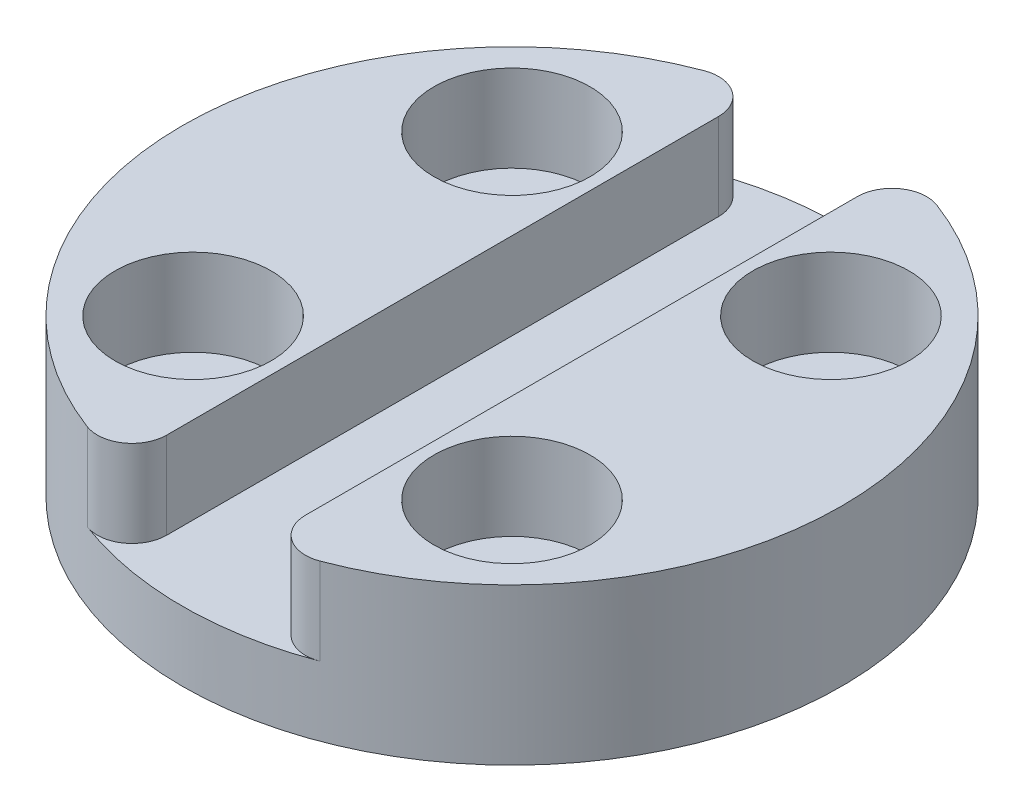
ISO-10303-21;
HEADER;
FILE_DESCRIPTION(('STEP AP214'),'2;1');
FILE_NAME('part.step','',(''),(''),'','','');
FILE_SCHEMA(('AUTOMOTIVE_DESIGN { 1 0 10303 214 1 1 1 1 }'));
ENDSEC;
DATA;
#1=APPLICATION_CONTEXT('core data for automotive mechanical design processes');
#2=APPLICATION_PROTOCOL_DEFINITION('international standard','automotive_design',2000,#1);
#3=PRODUCT_CONTEXT('',#1,'mechanical');
#4=PRODUCT('Part','Part','',(#3));
#5=PRODUCT_RELATED_PRODUCT_CATEGORY('part','',(#4));
#6=PRODUCT_DEFINITION_FORMATION('','',#4);
#7=PRODUCT_DEFINITION_CONTEXT('part definition',#1,'design');
#8=PRODUCT_DEFINITION('design','',#6,#7);
#9=PRODUCT_DEFINITION_SHAPE('','',#8);
#10=(LENGTH_UNIT() NAMED_UNIT(*) SI_UNIT(.MILLI.,.METRE.));
#11=(NAMED_UNIT(*) PLANE_ANGLE_UNIT() SI_UNIT($,.RADIAN.));
#12=(NAMED_UNIT(*) SI_UNIT($,.STERADIAN.) SOLID_ANGLE_UNIT());
#13=UNCERTAINTY_MEASURE_WITH_UNIT(LENGTH_MEASURE(1.E-05),#10,'distance_accuracy_value','');
#14=(GEOMETRIC_REPRESENTATION_CONTEXT(3) GLOBAL_UNCERTAINTY_ASSIGNED_CONTEXT((#13)) GLOBAL_UNIT_ASSIGNED_CONTEXT((#10,
#11,#12)) REPRESENTATION_CONTEXT('',''));
#15=CARTESIAN_POINT('',(0.,0.,0.));
#16=DIRECTION('',(0.,0.,1.));
#17=DIRECTION('',(1.,0.,0.));
#18=AXIS2_PLACEMENT_3D('',#15,#16,#17);
#19=CARTESIAN_POINT('',(0.,2.,0.));
#20=DIRECTION('',(0.,1.,0.));
#21=DIRECTION('',(0.,0.,1.));
#22=AXIS2_PLACEMENT_3D('',#19,#20,#21);
#23=PLANE('',#22);
#24=CARTESIAN_POINT('',(-4.5961940777126,2.,4.59619407771252));
#25=DIRECTION('',(0.,1.,0.));
#26=DIRECTION('',(0.,0.,1.));
#27=AXIS2_PLACEMENT_3D('',#24,#25,#26);
#28=CIRCLE('',#27,1.25000000000943);
#29=CARTESIAN_POINT('',(-4.5961940777126,2.,5.84619407772195));
#30=VERTEX_POINT('',#29);
#31=EDGE_CURVE('E191',#30,#30,#28,.T.);
#32=ORIENTED_EDGE('',*,*,#31,.F.);
#33=EDGE_LOOP('',(#32));
#34=FACE_BOUND('',#33,.T.);
#35=CARTESIAN_POINT('',(-4.5961940777126,2.,4.59619407771252));
#36=DIRECTION('',(0.,1.,0.));
#37=DIRECTION('',(0.,0.,1.));
#38=AXIS2_PLACEMENT_3D('',#35,#36,#37);
#39=CIRCLE('',#38,2.25);
#40=CARTESIAN_POINT('',(-4.5961940777126,2.,6.84619407771252));
#41=VERTEX_POINT('',#40);
#42=EDGE_CURVE('E11',#41,#41,#39,.F.);
#43=ORIENTED_EDGE('',*,*,#42,.F.);
#44=EDGE_LOOP('',(#43));
#45=FACE_BOUND('',#44,.T.);
#46=ADVANCED_FACE('F37',(#34,#45),#23,.T.);
#47=CARTESIAN_POINT('',(-4.5961940777125,2.,-4.59619407771261));
#48=DIRECTION('',(0.,1.,0.));
#49=DIRECTION('',(0.,0.,1.));
#50=AXIS2_PLACEMENT_3D('',#47,#48,#49);
#51=CIRCLE('',#50,1.25000000000943);
#52=CARTESIAN_POINT('',(-4.5961940777125,2.,-3.34619407770318));
#53=VERTEX_POINT('',#52);
#54=EDGE_CURVE('E185',#53,#53,#51,.T.);
#55=ORIENTED_EDGE('',*,*,#54,.F.);
#56=EDGE_LOOP('',(#55));
#57=FACE_BOUND('',#56,.T.);
#58=CARTESIAN_POINT('',(-4.5961940777125,2.,-4.59619407771261));
#59=DIRECTION('',(0.,1.,0.));
#60=DIRECTION('',(0.,0.,1.));
#61=AXIS2_PLACEMENT_3D('',#58,#59,#60);
#62=CIRCLE('',#61,2.25);
#63=CARTESIAN_POINT('',(-4.5961940777125,2.,-2.34619407771261));
#64=VERTEX_POINT('',#63);
#65=EDGE_CURVE('E45',#64,#64,#62,.F.);
#66=ORIENTED_EDGE('',*,*,#65,.F.);
#67=EDGE_LOOP('',(#66));
#68=FACE_BOUND('',#67,.T.);
#69=ADVANCED_FACE('F214',(#57,#68),#23,.T.);
#70=CARTESIAN_POINT('',(4.59619407771256,2.,-4.59619407771255));
#71=DIRECTION('',(0.,1.,0.));
#72=DIRECTION('',(0.,0.,1.));
#73=AXIS2_PLACEMENT_3D('',#70,#71,#72);
#74=CIRCLE('',#73,1.25000000000943);
#75=CARTESIAN_POINT('',(4.59619407771256,2.,-3.34619407770312));
#76=VERTEX_POINT('',#75);
#77=EDGE_CURVE('E203',#76,#76,#74,.T.);
#78=ORIENTED_EDGE('',*,*,#77,.F.);
#79=EDGE_LOOP('',(#78));
#80=FACE_BOUND('',#79,.T.);
#81=CARTESIAN_POINT('',(4.59619407771256,2.,-4.59619407771255));
#82=DIRECTION('',(0.,1.,0.));
#83=DIRECTION('',(0.,0.,1.));
#84=AXIS2_PLACEMENT_3D('',#81,#82,#83);
#85=CIRCLE('',#84,2.25);
#86=CARTESIAN_POINT('',(4.59619407771256,2.,-2.34619407771255));
#87=VERTEX_POINT('',#86);
#88=EDGE_CURVE('E149',#87,#87,#85,.T.);
#89=ORIENTED_EDGE('',*,*,#88,.T.);
#90=EDGE_LOOP('',(#89));
#91=FACE_BOUND('',#90,.T.);
#92=ADVANCED_FACE('F216',(#80,#91),#23,.T.);
#93=CARTESIAN_POINT('',(4.59619407771255,2.,4.59619407771257));
#94=DIRECTION('',(0.,1.,0.));
#95=DIRECTION('',(0.,0.,1.));
#96=AXIS2_PLACEMENT_3D('',#93,#94,#95);
#97=CIRCLE('',#96,1.25000000000944);
#98=CARTESIAN_POINT('',(4.59619407771255,2.,5.84619407772201));
#99=VERTEX_POINT('',#98);
#100=EDGE_CURVE('E197',#99,#99,#97,.T.);
#101=ORIENTED_EDGE('',*,*,#100,.F.);
#102=EDGE_LOOP('',(#101));
#103=FACE_BOUND('',#102,.T.);
#104=CARTESIAN_POINT('',(4.59619407771255,2.,4.59619407771257));
#105=DIRECTION('',(0.,1.,0.));
#106=DIRECTION('',(0.,0.,1.));
#107=AXIS2_PLACEMENT_3D('',#104,#105,#106);
#108=CIRCLE('',#107,2.25);
#109=CARTESIAN_POINT('',(4.59619407771255,2.,6.84619407771257));
#110=VERTEX_POINT('',#109);
#111=EDGE_CURVE('E145',#110,#110,#108,.T.);
#112=ORIENTED_EDGE('',*,*,#111,.T.);
#113=EDGE_LOOP('',(#112));
#114=FACE_BOUND('',#113,.T.);
#115=ADVANCED_FACE('F223',(#103,#114),#23,.T.);
#116=DIRECTION('',(0.,0.,-1.));
#117=VECTOR('',#116,1.);
#118=CARTESIAN_POINT('',(-2.,2.,-7.95298686029343));
#119=LINE('',#118,#117);
#120=CARTESIAN_POINT('',(-2.,2.,7.95298686029343));
#121=VERTEX_POINT('',#120);
#122=CARTESIAN_POINT('',(-2.,2.,-7.95298686029343));
#123=VERTEX_POINT('',#122);
#124=EDGE_CURVE('E52',#121,#123,#119,.T.);
#125=ORIENTED_EDGE('',*,*,#124,.F.);
#126=CARTESIAN_POINT('',(-3.,2.,7.95298686029343));
#127=DIRECTION('',(0.,1.,0.));
#128=DIRECTION('',(0.,0.,-1.));
#129=AXIS2_PLACEMENT_3D('',#126,#127,#128);
#130=CIRCLE('',#129,1.);
#131=CARTESIAN_POINT('',(-3.35294117647059,2.,8.88863237326913));
#132=VERTEX_POINT('',#131);
#133=EDGE_CURVE('E115',#132,#121,#130,.T.);
#134=ORIENTED_EDGE('',*,*,#133,.F.);
#135=CARTESIAN_POINT('',(0.,2.,0.));
#136=DIRECTION('',(0.,1.,0.));
#137=DIRECTION('',(0.,0.,1.));
#138=AXIS2_PLACEMENT_3D('',#135,#136,#137);
#139=CIRCLE('',#138,9.5);
#140=CARTESIAN_POINT('',(3.35294117647059,2.,8.88863237326913));
#141=VERTEX_POINT('',#140);
#142=EDGE_CURVE('E101',#132,#141,#139,.T.);
#143=ORIENTED_EDGE('',*,*,#142,.T.);
#144=CARTESIAN_POINT('',(3.,2.,7.95298686029343));
#145=DIRECTION('',(0.,1.,0.));
#146=DIRECTION('',(0.,0.,1.));
#147=AXIS2_PLACEMENT_3D('',#144,#145,#146);
#148=CIRCLE('',#147,1.);
#149=CARTESIAN_POINT('',(2.,2.,7.95298686029343));
#150=VERTEX_POINT('',#149);
#151=EDGE_CURVE('E155',#150,#141,#148,.T.);
#152=ORIENTED_EDGE('',*,*,#151,.F.);
#153=DIRECTION('',(0.,0.,1.));
#154=VECTOR('',#153,1.);
#155=CARTESIAN_POINT('',(2.,2.,-7.95298686029343));
#156=LINE('',#155,#154);
#157=CARTESIAN_POINT('',(2.,2.,-7.95298686029343));
#158=VERTEX_POINT('',#157);
#159=EDGE_CURVE('E162',#158,#150,#156,.T.);
#160=ORIENTED_EDGE('',*,*,#159,.F.);
#161=CARTESIAN_POINT('',(3.,2.,-7.95298686029343));
#162=DIRECTION('',(0.,1.,0.));
#163=DIRECTION('',(0.,0.,-1.));
#164=AXIS2_PLACEMENT_3D('',#161,#162,#163);
#165=CIRCLE('',#164,1.);
#166=CARTESIAN_POINT('',(3.35294117647059,2.,-8.88863237326913));
#167=VERTEX_POINT('',#166);
#168=EDGE_CURVE('E170',#167,#158,#165,.T.);
#169=ORIENTED_EDGE('',*,*,#168,.F.);
#170=CARTESIAN_POINT('',(-3.35294117647059,2.,-8.88863237326913));
#171=VERTEX_POINT('',#170);
#172=EDGE_CURVE('E111',#167,#171,#139,.T.);
#173=ORIENTED_EDGE('',*,*,#172,.T.);
#174=CARTESIAN_POINT('',(-3.,2.,-7.95298686029343));
#175=DIRECTION('',(0.,1.,0.));
#176=DIRECTION('',(0.,0.,1.));
#177=AXIS2_PLACEMENT_3D('',#174,#175,#176);
#178=CIRCLE('',#177,1.);
#179=EDGE_CURVE('E57',#123,#171,#178,.T.);
#180=ORIENTED_EDGE('',*,*,#179,.F.);
#181=EDGE_LOOP('',(#125,#134,#143,#152,#160,#169,#173,#180));
#182=FACE_BOUND('',#181,.T.);
#183=ADVANCED_FACE('F116',(#182),#23,.T.);
#184=CARTESIAN_POINT('',(0.,0.,0.));
#185=DIRECTION('',(0.,1.,0.));
#186=DIRECTION('',(0.,0.,1.));
#187=AXIS2_PLACEMENT_3D('',#184,#185,#186);
#188=PLANE('',#187);
#189=CARTESIAN_POINT('',(0.,0.,0.));
#190=DIRECTION('',(0.,1.,0.));
#191=DIRECTION('',(0.,0.,1.));
#192=AXIS2_PLACEMENT_3D('',#189,#190,#191);
#193=CIRCLE('',#192,9.5);
#194=CARTESIAN_POINT('',(0.,0.,9.5));
#195=VERTEX_POINT('',#194);
#196=EDGE_CURVE('E112',#195,#195,#193,.T.);
#197=ORIENTED_EDGE('',*,*,#196,.F.);
#198=EDGE_LOOP('',(#197));
#199=FACE_BOUND('',#198,.T.);
#200=CARTESIAN_POINT('',(4.59619407771256,0.,-4.59619407771255));
#201=DIRECTION('',(0.,1.,0.));
#202=DIRECTION('',(0.,0.,1.));
#203=AXIS2_PLACEMENT_3D('',#200,#201,#202);
#204=CIRCLE('',#203,1.25000000000943);
#205=CARTESIAN_POINT('',(4.59619407771256,0.,-3.34619407770312));
#206=VERTEX_POINT('',#205);
#207=EDGE_CURVE('E200',#206,#206,#204,.T.);
#208=ORIENTED_EDGE('',*,*,#207,.T.);
#209=EDGE_LOOP('',(#208));
#210=FACE_BOUND('',#209,.T.);
#211=CARTESIAN_POINT('',(4.59619407771255,0.,4.59619407771257));
#212=DIRECTION('',(0.,1.,0.));
#213=DIRECTION('',(0.,0.,1.));
#214=AXIS2_PLACEMENT_3D('',#211,#212,#213);
#215=CIRCLE('',#214,1.25000000000944);
#216=CARTESIAN_POINT('',(4.59619407771255,0.,5.84619407772201));
#217=VERTEX_POINT('',#216);
#218=EDGE_CURVE('E194',#217,#217,#215,.T.);
#219=ORIENTED_EDGE('',*,*,#218,.T.);
#220=EDGE_LOOP('',(#219));
#221=FACE_BOUND('',#220,.T.);
#222=CARTESIAN_POINT('',(-4.5961940777126,0.,4.59619407771252));
#223=DIRECTION('',(0.,1.,0.));
#224=DIRECTION('',(0.,0.,1.));
#225=AXIS2_PLACEMENT_3D('',#222,#223,#224);
#226=CIRCLE('',#225,1.25000000000943);
#227=CARTESIAN_POINT('',(-4.5961940777126,0.,5.84619407772195));
#228=VERTEX_POINT('',#227);
#229=EDGE_CURVE('E188',#228,#228,#226,.T.);
#230=ORIENTED_EDGE('',*,*,#229,.T.);
#231=EDGE_LOOP('',(#230));
#232=FACE_BOUND('',#231,.T.);
#233=CARTESIAN_POINT('',(-4.5961940777125,0.,-4.59619407771261));
#234=DIRECTION('',(0.,1.,0.));
#235=DIRECTION('',(0.,0.,1.));
#236=AXIS2_PLACEMENT_3D('',#233,#234,#235);
#237=CIRCLE('',#236,1.25000000000943);
#238=CARTESIAN_POINT('',(-4.5961940777125,0.,-3.34619407770318));
#239=VERTEX_POINT('',#238);
#240=EDGE_CURVE('E184',#239,#239,#237,.T.);
#241=ORIENTED_EDGE('',*,*,#240,.T.);
#242=EDGE_LOOP('',(#241));
#243=FACE_BOUND('',#242,.T.);
#244=ADVANCED_FACE('F229',(#199,#210,#221,#232,#243),#188,.F.);
#245=CARTESIAN_POINT('',(0.,2.,0.));
#246=DIRECTION('',(0.,-1.,0.));
#247=DIRECTION('',(0.,0.,-1.));
#248=AXIS2_PLACEMENT_3D('',#245,#246,#247);
#249=CYLINDRICAL_SURFACE('',#248,9.5);
#250=ORIENTED_EDGE('',*,*,#172,.F.);
#251=DIRECTION('',(0.,-1.,0.));
#252=VECTOR('',#251,1.);
#253=CARTESIAN_POINT('',(3.35294117647059,4.5,-8.88863237326913));
#254=LINE('',#253,#252);
#255=CARTESIAN_POINT('',(3.35294117647059,4.5,-8.88863237326913));
#256=VERTEX_POINT('',#255);
#257=EDGE_CURVE('E180',#256,#167,#254,.T.);
#258=ORIENTED_EDGE('',*,*,#257,.F.);
#259=CARTESIAN_POINT('',(0.,4.5,0.));
#260=DIRECTION('',(0.,1.,0.));
#261=DIRECTION('',(0.,0.,1.));
#262=AXIS2_PLACEMENT_3D('',#259,#260,#261);
#263=CIRCLE('',#262,9.5);
#264=CARTESIAN_POINT('',(3.35294117647059,4.5,8.88863237326913));
#265=VERTEX_POINT('',#264);
#266=EDGE_CURVE('E161',#265,#256,#263,.T.);
#267=ORIENTED_EDGE('',*,*,#266,.F.);
#268=DIRECTION('',(0.,-1.,0.));
#269=VECTOR('',#268,1.);
#270=CARTESIAN_POINT('',(3.35294117647059,4.5,8.88863237326913));
#271=LINE('',#270,#269);
#272=EDGE_CURVE('E109',#265,#141,#271,.T.);
#273=ORIENTED_EDGE('',*,*,#272,.T.);
#274=ORIENTED_EDGE('',*,*,#142,.F.);
#275=DIRECTION('',(0.,-1.,0.));
#276=VECTOR('',#275,1.);
#277=CARTESIAN_POINT('',(-3.35294117647059,4.5,8.88863237326913));
#278=LINE('',#277,#276);
#279=CARTESIAN_POINT('',(-3.35294117647059,4.5,8.88863237326913));
#280=VERTEX_POINT('',#279);
#281=EDGE_CURVE('E106',#280,#132,#278,.T.);
#282=ORIENTED_EDGE('',*,*,#281,.F.);
#283=CARTESIAN_POINT('',(0.,4.5,0.));
#284=DIRECTION('',(0.,1.,0.));
#285=DIRECTION('',(0.,0.,1.));
#286=AXIS2_PLACEMENT_3D('',#283,#284,#285);
#287=CIRCLE('',#286,9.5);
#288=CARTESIAN_POINT('',(-3.35294117647059,4.5,-8.88863237326913));
#289=VERTEX_POINT('',#288);
#290=EDGE_CURVE('E124',#289,#280,#287,.T.);
#291=ORIENTED_EDGE('',*,*,#290,.F.);
#292=DIRECTION('',(0.,-1.,0.));
#293=VECTOR('',#292,1.);
#294=CARTESIAN_POINT('',(-3.35294117647059,4.5,-8.88863237326913));
#295=LINE('',#294,#293);
#296=EDGE_CURVE('E125',#289,#171,#295,.T.);
#297=ORIENTED_EDGE('',*,*,#296,.T.);
#298=EDGE_LOOP('',(#250,#258,#267,#273,#274,#282,#291,#297));
#299=FACE_BOUND('',#298,.T.);
#300=ORIENTED_EDGE('',*,*,#196,.T.);
#301=EDGE_LOOP('',(#300));
#302=FACE_BOUND('',#301,.T.);
#303=ADVANCED_FACE('F39',(#299,#302),#249,.T.);
#304=CARTESIAN_POINT('',(4.59619407771256,2.,-4.59619407771255));
#305=DIRECTION('',(0.,-1.,0.));
#306=DIRECTION('',(0.,0.,-1.));
#307=AXIS2_PLACEMENT_3D('',#304,#305,#306);
#308=CYLINDRICAL_SURFACE('',#307,1.25000000000943);
#309=ORIENTED_EDGE('',*,*,#77,.T.);
#310=EDGE_LOOP('',(#309));
#311=FACE_BOUND('',#310,.T.);
#312=ORIENTED_EDGE('',*,*,#207,.F.);
#313=EDGE_LOOP('',(#312));
#314=FACE_BOUND('',#313,.T.);
#315=ADVANCED_FACE('F230',(#311,#314),#308,.F.);
#316=CARTESIAN_POINT('',(4.59619407771255,2.,4.59619407771257));
#317=DIRECTION('',(0.,-1.,0.));
#318=DIRECTION('',(0.,0.,-1.));
#319=AXIS2_PLACEMENT_3D('',#316,#317,#318);
#320=CYLINDRICAL_SURFACE('',#319,1.25000000000944);
#321=ORIENTED_EDGE('',*,*,#100,.T.);
#322=EDGE_LOOP('',(#321));
#323=FACE_BOUND('',#322,.T.);
#324=ORIENTED_EDGE('',*,*,#218,.F.);
#325=EDGE_LOOP('',(#324));
#326=FACE_BOUND('',#325,.T.);
#327=ADVANCED_FACE('F260',(#323,#326),#320,.F.);
#328=CARTESIAN_POINT('',(-4.5961940777126,2.,4.59619407771252));
#329=DIRECTION('',(0.,-1.,0.));
#330=DIRECTION('',(0.,0.,-1.));
#331=AXIS2_PLACEMENT_3D('',#328,#329,#330);
#332=CYLINDRICAL_SURFACE('',#331,1.25000000000943);
#333=ORIENTED_EDGE('',*,*,#31,.T.);
#334=EDGE_LOOP('',(#333));
#335=FACE_BOUND('',#334,.T.);
#336=ORIENTED_EDGE('',*,*,#229,.F.);
#337=EDGE_LOOP('',(#336));
#338=FACE_BOUND('',#337,.T.);
#339=ADVANCED_FACE('F250',(#335,#338),#332,.F.);
#340=CARTESIAN_POINT('',(-4.5961940777125,2.,-4.59619407771261));
#341=DIRECTION('',(0.,-1.,0.));
#342=DIRECTION('',(0.,0.,-1.));
#343=AXIS2_PLACEMENT_3D('',#340,#341,#342);
#344=CYLINDRICAL_SURFACE('',#343,1.25000000000943);
#345=ORIENTED_EDGE('',*,*,#54,.T.);
#346=EDGE_LOOP('',(#345));
#347=FACE_BOUND('',#346,.T.);
#348=ORIENTED_EDGE('',*,*,#240,.F.);
#349=EDGE_LOOP('',(#348));
#350=FACE_BOUND('',#349,.T.);
#351=ADVANCED_FACE('F247',(#347,#350),#344,.F.);
#352=CARTESIAN_POINT('',(3.,4.5,7.95298686029343));
#353=DIRECTION('',(0.,1.,0.));
#354=DIRECTION('',(0.,0.,1.));
#355=AXIS2_PLACEMENT_3D('',#352,#353,#354);
#356=PLANE('',#355);
#357=CARTESIAN_POINT('',(4.59619407771256,4.5,-4.59619407771255));
#358=DIRECTION('',(0.,1.,0.));
#359=DIRECTION('',(0.,0.,1.));
#360=AXIS2_PLACEMENT_3D('',#357,#358,#359);
#361=CIRCLE('',#360,2.25);
#362=CARTESIAN_POINT('',(4.59619407771256,4.5,-2.34619407771255));
#363=VERTEX_POINT('',#362);
#364=EDGE_CURVE('E152',#363,#363,#361,.T.);
#365=ORIENTED_EDGE('',*,*,#364,.F.);
#366=EDGE_LOOP('',(#365));
#367=FACE_BOUND('',#366,.T.);
#368=CARTESIAN_POINT('',(3.,4.5,7.95298686029343));
#369=DIRECTION('',(0.,1.,0.));
#370=DIRECTION('',(0.,0.,1.));
#371=AXIS2_PLACEMENT_3D('',#368,#369,#370);
#372=CIRCLE('',#371,1.);
#373=CARTESIAN_POINT('',(2.,4.5,7.95298686029343));
#374=VERTEX_POINT('',#373);
#375=EDGE_CURVE('E158',#374,#265,#372,.T.);
#376=ORIENTED_EDGE('',*,*,#375,.T.);
#377=ORIENTED_EDGE('',*,*,#266,.T.);
#378=CARTESIAN_POINT('',(3.,4.5,-7.95298686029343));
#379=DIRECTION('',(0.,1.,0.));
#380=DIRECTION('',(0.,0.,-1.));
#381=AXIS2_PLACEMENT_3D('',#378,#379,#380);
#382=CIRCLE('',#381,1.);
#383=CARTESIAN_POINT('',(2.,4.5,-7.95298686029343));
#384=VERTEX_POINT('',#383);
#385=EDGE_CURVE('E164',#256,#384,#382,.T.);
#386=ORIENTED_EDGE('',*,*,#385,.T.);
#387=DIRECTION('',(0.,0.,1.));
#388=VECTOR('',#387,1.);
#389=CARTESIAN_POINT('',(2.,4.5,-7.95298686029343));
#390=LINE('',#389,#388);
#391=EDGE_CURVE('E166',#384,#374,#390,.T.);
#392=ORIENTED_EDGE('',*,*,#391,.T.);
#393=EDGE_LOOP('',(#376,#377,#386,#392));
#394=FACE_BOUND('',#393,.T.);
#395=CARTESIAN_POINT('',(4.59619407771255,4.5,4.59619407771257));
#396=DIRECTION('',(0.,1.,0.));
#397=DIRECTION('',(0.,0.,1.));
#398=AXIS2_PLACEMENT_3D('',#395,#396,#397);
#399=CIRCLE('',#398,2.25);
#400=CARTESIAN_POINT('',(4.59619407771255,4.5,6.84619407771257));
#401=VERTEX_POINT('',#400);
#402=EDGE_CURVE('E146',#401,#401,#399,.T.);
#403=ORIENTED_EDGE('',*,*,#402,.F.);
#404=EDGE_LOOP('',(#403));
#405=FACE_BOUND('',#404,.T.);
#406=ADVANCED_FACE('F249',(#367,#394,#405),#356,.T.);
#407=CARTESIAN_POINT('',(3.,4.5,7.95298686029343));
#408=DIRECTION('',(0.,-1.,0.));
#409=DIRECTION('',(0.,0.,-1.));
#410=AXIS2_PLACEMENT_3D('',#407,#408,#409);
#411=CYLINDRICAL_SURFACE('',#410,1.);
#412=ORIENTED_EDGE('',*,*,#151,.T.);
#413=ORIENTED_EDGE('',*,*,#272,.F.);
#414=ORIENTED_EDGE('',*,*,#375,.F.);
#415=DIRECTION('',(0.,-1.,0.));
#416=VECTOR('',#415,1.);
#417=CARTESIAN_POINT('',(2.,4.5,7.95298686029343));
#418=LINE('',#417,#416);
#419=EDGE_CURVE('E168',#374,#150,#418,.T.);
#420=ORIENTED_EDGE('',*,*,#419,.T.);
#421=EDGE_LOOP('',(#412,#413,#414,#420));
#422=FACE_BOUND('',#421,.T.);
#423=ADVANCED_FACE('F257',(#422),#411,.T.);
#424=CARTESIAN_POINT('',(3.,4.5,-7.95298686029343));
#425=DIRECTION('',(0.,-1.,0.));
#426=DIRECTION('',(0.,0.,-1.));
#427=AXIS2_PLACEMENT_3D('',#424,#425,#426);
#428=CYLINDRICAL_SURFACE('',#427,1.);
#429=ORIENTED_EDGE('',*,*,#168,.T.);
#430=DIRECTION('',(0.,-1.,0.));
#431=VECTOR('',#430,1.);
#432=CARTESIAN_POINT('',(2.,4.5,-7.95298686029343));
#433=LINE('',#432,#431);
#434=EDGE_CURVE('E177',#384,#158,#433,.T.);
#435=ORIENTED_EDGE('',*,*,#434,.F.);
#436=ORIENTED_EDGE('',*,*,#385,.F.);
#437=ORIENTED_EDGE('',*,*,#257,.T.);
#438=EDGE_LOOP('',(#429,#435,#436,#437));
#439=FACE_BOUND('',#438,.T.);
#440=ADVANCED_FACE('F297',(#439),#428,.T.);
#441=CARTESIAN_POINT('',(2.,4.5,-7.95298686029343));
#442=DIRECTION('',(1.,0.,0.));
#443=DIRECTION('',(0.,0.,-1.));
#444=AXIS2_PLACEMENT_3D('',#441,#442,#443);
#445=PLANE('',#444);
#446=ORIENTED_EDGE('',*,*,#159,.T.);
#447=ORIENTED_EDGE('',*,*,#419,.F.);
#448=ORIENTED_EDGE('',*,*,#391,.F.);
#449=ORIENTED_EDGE('',*,*,#434,.T.);
#450=EDGE_LOOP('',(#446,#447,#448,#449));
#451=FACE_BOUND('',#450,.T.);
#452=ADVANCED_FACE('F290',(#451),#445,.F.);
#453=CARTESIAN_POINT('',(4.59619407771256,4.5,-4.59619407771255));
#454=DIRECTION('',(0.,-1.,0.));
#455=DIRECTION('',(0.,0.,-1.));
#456=AXIS2_PLACEMENT_3D('',#453,#454,#455);
#457=CYLINDRICAL_SURFACE('',#456,2.25);
#458=ORIENTED_EDGE('',*,*,#364,.T.);
#459=EDGE_LOOP('',(#458));
#460=FACE_BOUND('',#459,.T.);
#461=ORIENTED_EDGE('',*,*,#88,.F.);
#462=EDGE_LOOP('',(#461));
#463=FACE_BOUND('',#462,.T.);
#464=ADVANCED_FACE('F281',(#460,#463),#457,.F.);
#465=CARTESIAN_POINT('',(4.59619407771255,4.5,4.59619407771257));
#466=DIRECTION('',(0.,-1.,0.));
#467=DIRECTION('',(0.,0.,-1.));
#468=AXIS2_PLACEMENT_3D('',#465,#466,#467);
#469=CYLINDRICAL_SURFACE('',#468,2.25);
#470=ORIENTED_EDGE('',*,*,#402,.T.);
#471=EDGE_LOOP('',(#470));
#472=FACE_BOUND('',#471,.T.);
#473=ORIENTED_EDGE('',*,*,#111,.F.);
#474=EDGE_LOOP('',(#473));
#475=FACE_BOUND('',#474,.T.);
#476=ADVANCED_FACE('F278',(#472,#475),#469,.F.);
#477=CARTESIAN_POINT('',(-3.,4.5,7.95298686029343));
#478=DIRECTION('',(0.,-1.,0.));
#479=DIRECTION('',(0.,0.,-1.));
#480=AXIS2_PLACEMENT_3D('',#477,#478,#479);
#481=PLANE('',#480);
#482=CARTESIAN_POINT('',(-3.,4.5,7.95298686029343));
#483=DIRECTION('',(0.,1.,0.));
#484=DIRECTION('',(0.,0.,-1.));
#485=AXIS2_PLACEMENT_3D('',#482,#483,#484);
#486=CIRCLE('',#485,1.);
#487=CARTESIAN_POINT('',(-2.,4.5,7.95298686029343));
#488=VERTEX_POINT('',#487);
#489=EDGE_CURVE('E123',#280,#488,#486,.T.);
#490=ORIENTED_EDGE('',*,*,#489,.T.);
#491=DIRECTION('',(0.,0.,-1.));
#492=VECTOR('',#491,1.);
#493=CARTESIAN_POINT('',(-2.,4.5,-7.95298686029343));
#494=LINE('',#493,#492);
#495=CARTESIAN_POINT('',(-2.,4.5,-7.95298686029343));
#496=VERTEX_POINT('',#495);
#497=EDGE_CURVE('E137',#488,#496,#494,.T.);
#498=ORIENTED_EDGE('',*,*,#497,.T.);
#499=CARTESIAN_POINT('',(-3.,4.5,-7.95298686029343));
#500=DIRECTION('',(0.,1.,0.));
#501=DIRECTION('',(0.,0.,1.));
#502=AXIS2_PLACEMENT_3D('',#499,#500,#501);
#503=CIRCLE('',#502,1.);
#504=EDGE_CURVE('E127',#496,#289,#503,.T.);
#505=ORIENTED_EDGE('',*,*,#504,.T.);
#506=ORIENTED_EDGE('',*,*,#290,.T.);
#507=EDGE_LOOP('',(#490,#498,#505,#506));
#508=FACE_BOUND('',#507,.T.);
#509=CARTESIAN_POINT('',(-4.5961940777126,4.5,4.59619407771252));
#510=DIRECTION('',(0.,1.,0.));
#511=DIRECTION('',(0.,0.,1.));
#512=AXIS2_PLACEMENT_3D('',#509,#510,#511);
#513=CIRCLE('',#512,2.25);
#514=CARTESIAN_POINT('',(-4.5961940777126,4.5,6.84619407771252));
#515=VERTEX_POINT('',#514);
#516=EDGE_CURVE('E119',#515,#515,#513,.T.);
#517=ORIENTED_EDGE('',*,*,#516,.F.);
#518=EDGE_LOOP('',(#517));
#519=FACE_BOUND('',#518,.T.);
#520=CARTESIAN_POINT('',(-4.5961940777125,4.5,-4.59619407771261));
#521=DIRECTION('',(0.,1.,0.));
#522=DIRECTION('',(0.,0.,1.));
#523=AXIS2_PLACEMENT_3D('',#520,#521,#522);
#524=CIRCLE('',#523,2.25);
#525=CARTESIAN_POINT('',(-4.5961940777125,4.5,-2.34619407771261));
#526=VERTEX_POINT('',#525);
#527=EDGE_CURVE('E142',#526,#526,#524,.T.);
#528=ORIENTED_EDGE('',*,*,#527,.F.);
#529=EDGE_LOOP('',(#528));
#530=FACE_BOUND('',#529,.T.);
#531=ADVANCED_FACE('F280',(#508,#519,#530),#481,.F.);
#532=CARTESIAN_POINT('',(-3.,4.5,7.95298686029343));
#533=DIRECTION('',(0.,-1.,0.));
#534=DIRECTION('',(0.,0.,-1.));
#535=AXIS2_PLACEMENT_3D('',#532,#533,#534);
#536=CYLINDRICAL_SURFACE('',#535,1.);
#537=ORIENTED_EDGE('',*,*,#133,.T.);
#538=DIRECTION('',(0.,-1.,0.));
#539=VECTOR('',#538,1.);
#540=CARTESIAN_POINT('',(-2.,4.5,7.95298686029343));
#541=LINE('',#540,#539);
#542=EDGE_CURVE('E320',#488,#121,#541,.T.);
#543=ORIENTED_EDGE('',*,*,#542,.F.);
#544=ORIENTED_EDGE('',*,*,#489,.F.);
#545=ORIENTED_EDGE('',*,*,#281,.T.);
#546=EDGE_LOOP('',(#537,#543,#544,#545));
#547=FACE_BOUND('',#546,.T.);
#548=ADVANCED_FACE('F121',(#547),#536,.T.);
#549=CARTESIAN_POINT('',(-2.,4.5,-7.95298686029343));
#550=DIRECTION('',(-1.,0.,0.));
#551=DIRECTION('',(0.,0.,1.));
#552=AXIS2_PLACEMENT_3D('',#549,#550,#551);
#553=PLANE('',#552);
#554=ORIENTED_EDGE('',*,*,#124,.T.);
#555=DIRECTION('',(0.,-1.,0.));
#556=VECTOR('',#555,1.);
#557=CARTESIAN_POINT('',(-2.,4.5,-7.95298686029343));
#558=LINE('',#557,#556);
#559=EDGE_CURVE('E130',#496,#123,#558,.T.);
#560=ORIENTED_EDGE('',*,*,#559,.F.);
#561=ORIENTED_EDGE('',*,*,#497,.F.);
#562=ORIENTED_EDGE('',*,*,#542,.T.);
#563=EDGE_LOOP('',(#554,#560,#561,#562));
#564=FACE_BOUND('',#563,.T.);
#565=ADVANCED_FACE('F322',(#564),#553,.F.);
#566=CARTESIAN_POINT('',(-3.,4.5,-7.95298686029343));
#567=DIRECTION('',(0.,-1.,0.));
#568=DIRECTION('',(0.,0.,-1.));
#569=AXIS2_PLACEMENT_3D('',#566,#567,#568);
#570=CYLINDRICAL_SURFACE('',#569,1.);
#571=ORIENTED_EDGE('',*,*,#179,.T.);
#572=ORIENTED_EDGE('',*,*,#296,.F.);
#573=ORIENTED_EDGE('',*,*,#504,.F.);
#574=ORIENTED_EDGE('',*,*,#559,.T.);
#575=EDGE_LOOP('',(#571,#572,#573,#574));
#576=FACE_BOUND('',#575,.T.);
#577=ADVANCED_FACE('F316',(#576),#570,.T.);
#578=CARTESIAN_POINT('',(-4.5961940777126,4.5,4.59619407771252));
#579=DIRECTION('',(0.,-1.,0.));
#580=DIRECTION('',(0.,0.,-1.));
#581=AXIS2_PLACEMENT_3D('',#578,#579,#580);
#582=CYLINDRICAL_SURFACE('',#581,2.25);
#583=ORIENTED_EDGE('',*,*,#516,.T.);
#584=EDGE_LOOP('',(#583));
#585=FACE_BOUND('',#584,.T.);
#586=ORIENTED_EDGE('',*,*,#42,.T.);
#587=EDGE_LOOP('',(#586));
#588=FACE_BOUND('',#587,.T.);
#589=ADVANCED_FACE('F329',(#585,#588),#582,.F.);
#590=CARTESIAN_POINT('',(-4.5961940777125,4.5,-4.59619407771261));
#591=DIRECTION('',(0.,-1.,0.));
#592=DIRECTION('',(0.,0.,-1.));
#593=AXIS2_PLACEMENT_3D('',#590,#591,#592);
#594=CYLINDRICAL_SURFACE('',#593,2.25);
#595=ORIENTED_EDGE('',*,*,#527,.T.);
#596=EDGE_LOOP('',(#595));
#597=FACE_BOUND('',#596,.T.);
#598=ORIENTED_EDGE('',*,*,#65,.T.);
#599=EDGE_LOOP('',(#598));
#600=FACE_BOUND('',#599,.T.);
#601=ADVANCED_FACE('F212',(#597,#600),#594,.F.);
#602=CLOSED_SHELL('',(#46,#69,#92,#115,#183,#244,#303,#315,#327,#339,#351,#406,#423,#440,#452,
#464,#476,#531,#548,#565,#577,#589,#601));
#603=MANIFOLD_SOLID_BREP('B2',#602);
#604=ADVANCED_BREP_SHAPE_REPRESENTATION('',(#18,#603),#14);
#605=SHAPE_DEFINITION_REPRESENTATION(#9,#604);
ENDSEC;
END-ISO-10303-21;
